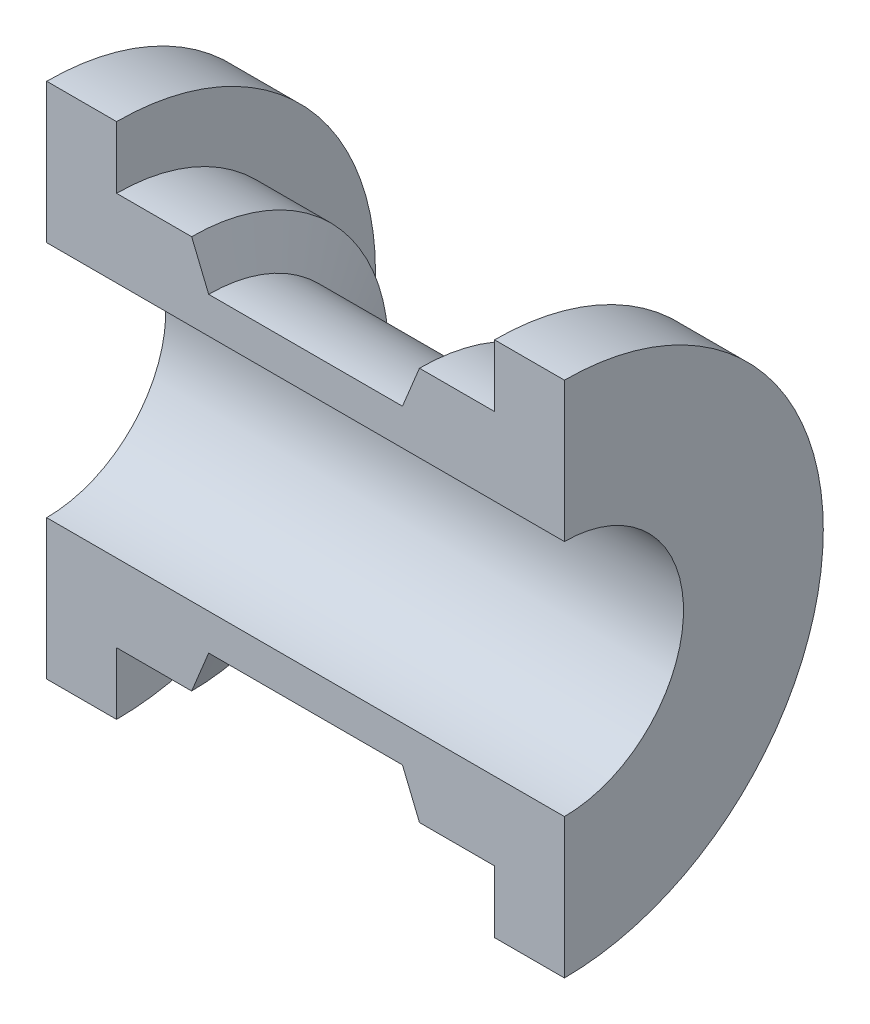
ISO-10303-21;
HEADER;
FILE_DESCRIPTION(('STEP AP214'),'2;1');
FILE_NAME('part.step','',(''),(''),'','','');
FILE_SCHEMA(('AUTOMOTIVE_DESIGN { 1 0 10303 214 1 1 1 1 }'));
ENDSEC;
DATA;
#1=APPLICATION_CONTEXT('core data for automotive mechanical design processes');
#2=APPLICATION_PROTOCOL_DEFINITION('international standard','automotive_design',2000,#1);
#3=PRODUCT_CONTEXT('',#1,'mechanical');
#4=PRODUCT('Part','Part','',(#3));
#5=PRODUCT_RELATED_PRODUCT_CATEGORY('part','',(#4));
#6=PRODUCT_DEFINITION_FORMATION('','',#4);
#7=PRODUCT_DEFINITION_CONTEXT('part definition',#1,'design');
#8=PRODUCT_DEFINITION('design','',#6,#7);
#9=PRODUCT_DEFINITION_SHAPE('','',#8);
#10=(LENGTH_UNIT() NAMED_UNIT(*) SI_UNIT(.MILLI.,.METRE.));
#11=(NAMED_UNIT(*) PLANE_ANGLE_UNIT() SI_UNIT($,.RADIAN.));
#12=(NAMED_UNIT(*) SI_UNIT($,.STERADIAN.) SOLID_ANGLE_UNIT());
#13=UNCERTAINTY_MEASURE_WITH_UNIT(LENGTH_MEASURE(1.E-05),#10,'distance_accuracy_value','');
#14=(GEOMETRIC_REPRESENTATION_CONTEXT(3) GLOBAL_UNCERTAINTY_ASSIGNED_CONTEXT((#13)) GLOBAL_UNIT_ASSIGNED_CONTEXT((#10,
#11,#12)) REPRESENTATION_CONTEXT('',''));
#15=CARTESIAN_POINT('',(0.,0.,0.));
#16=DIRECTION('',(0.,0.,1.));
#17=DIRECTION('',(1.,0.,0.));
#18=AXIS2_PLACEMENT_3D('',#15,#16,#17);
#19=CARTESIAN_POINT('',(-3.,0.,-12.2462854605711));
#20=DIRECTION('',(0.,0.,-1.));
#21=DIRECTION('',(-1.,0.,0.));
#22=AXIS2_PLACEMENT_3D('',#19,#20,#21);
#23=PLANE('',#22);
#24=CARTESIAN_POINT('',(0.,0.,-12.2462854605711));
#25=DIRECTION('',(0.,0.,1.));
#26=DIRECTION('',(1.,0.,0.));
#27=AXIS2_PLACEMENT_3D('',#24,#25,#26);
#28=CIRCLE('',#27,3.);
#29=CARTESIAN_POINT('',(3.,0.,-12.2462854605711));
#30=VERTEX_POINT('',#29);
#31=EDGE_CURVE('E49',#30,#30,#28,.T.);
#32=ORIENTED_EDGE('',*,*,#31,.T.);
#33=EDGE_LOOP('',(#32));
#34=FACE_BOUND('',#33,.T.);
#35=ADVANCED_FACE('F43',(#34),#23,.F.);
#36=CARTESIAN_POINT('',(-3.,0.,-20.));
#37=DIRECTION('',(0.,0.,1.));
#38=DIRECTION('',(1.,0.,0.));
#39=AXIS2_PLACEMENT_3D('',#36,#37,#38);
#40=PLANE('',#39);
#41=CARTESIAN_POINT('',(0.,0.,-20.));
#42=DIRECTION('',(0.,0.,1.));
#43=DIRECTION('',(1.,0.,0.));
#44=AXIS2_PLACEMENT_3D('',#41,#42,#43);
#45=CIRCLE('',#44,3.);
#46=CARTESIAN_POINT('',(3.,0.,-20.));
#47=VERTEX_POINT('',#46);
#48=EDGE_CURVE('E11',#47,#47,#45,.T.);
#49=ORIENTED_EDGE('',*,*,#48,.F.);
#50=EDGE_LOOP('',(#49));
#51=FACE_BOUND('',#50,.T.);
#52=ADVANCED_FACE('F58',(#51),#40,.F.);
#53=CARTESIAN_POINT('',(0.,0.,0.));
#54=DIRECTION('',(0.,0.,1.));
#55=DIRECTION('',(1.,0.,0.));
#56=AXIS2_PLACEMENT_3D('',#53,#54,#55);
#57=CYLINDRICAL_SURFACE('',#56,3.);
#58=ORIENTED_EDGE('',*,*,#31,.F.);
#59=EDGE_LOOP('',(#58));
#60=FACE_BOUND('',#59,.T.);
#61=ORIENTED_EDGE('',*,*,#48,.T.);
#62=EDGE_LOOP('',(#61));
#63=FACE_BOUND('',#62,.T.);
#64=ADVANCED_FACE('F56',(#60,#63),#57,.T.);
#65=CLOSED_SHELL('',(#35,#52,#64));
#66=MANIFOLD_SOLID_BREP('B2',#65);
#67=CARTESIAN_POINT('',(-25.,25.,1.74574066942157E-13));
#68=DIRECTION('',(-1.,0.,0.));
#69=DIRECTION('',(0.,0.,1.));
#70=AXIS2_PLACEMENT_3D('',#67,#68,#69);
#71=PLANE('',#70);
#72=CARTESIAN_POINT('',(-25.,0.,0.));
#73=DIRECTION('',(-1.,0.,0.));
#74=DIRECTION('',(0.,0.,1.));
#75=AXIS2_PLACEMENT_3D('',#72,#73,#74);
#76=CIRCLE('',#75,11.5);
#77=CARTESIAN_POINT('',(-25.,11.5,0.));
#78=VERTEX_POINT('',#77);
#79=CARTESIAN_POINT('',(-25.,-11.5,0.));
#80=VERTEX_POINT('',#79);
#81=EDGE_CURVE('E41',#78,#80,#76,.T.);
#82=ORIENTED_EDGE('',*,*,#81,.F.);
#83=DIRECTION('',(0.,1.,0.));
#84=VECTOR('',#83,1.);
#85=CARTESIAN_POINT('',(-25.,25.,1.74574066942157E-13));
#86=LINE('',#85,#84);
#87=CARTESIAN_POINT('',(-25.,25.,1.74574066942157E-13));
#88=VERTEX_POINT('',#87);
#89=EDGE_CURVE('E173',#78,#88,#86,.T.);
#90=ORIENTED_EDGE('',*,*,#89,.T.);
#91=CARTESIAN_POINT('',(-25.,0.,0.));
#92=DIRECTION('',(-1.,0.,0.));
#93=DIRECTION('',(0.,0.,1.));
#94=AXIS2_PLACEMENT_3D('',#91,#92,#93);
#95=CIRCLE('',#94,25.);
#96=CARTESIAN_POINT('',(-25.,-25.,0.));
#97=VERTEX_POINT('',#96);
#98=EDGE_CURVE('E168',#88,#97,#95,.T.);
#99=ORIENTED_EDGE('',*,*,#98,.T.);
#100=DIRECTION('',(0.,-1.,0.));
#101=VECTOR('',#100,1.);
#102=CARTESIAN_POINT('',(-25.,-25.,0.));
#103=LINE('',#102,#101);
#104=EDGE_CURVE('E171',#80,#97,#103,.T.);
#105=ORIENTED_EDGE('',*,*,#104,.F.);
#106=EDGE_LOOP('',(#82,#90,#99,#105));
#107=FACE_BOUND('',#106,.T.);
#108=ADVANCED_FACE('F84',(#107),#71,.T.);
#109=CARTESIAN_POINT('',(-23.8789507050663,0.,0.));
#110=DIRECTION('',(-1.,0.,0.));
#111=DIRECTION('',(0.,0.,1.));
#112=AXIS2_PLACEMENT_3D('',#109,#110,#111);
#113=CYLINDRICAL_SURFACE('',#112,11.5);
#114=CARTESIAN_POINT('',(25.,0.,0.));
#115=DIRECTION('',(-1.,0.,0.));
#116=DIRECTION('',(0.,0.,1.));
#117=AXIS2_PLACEMENT_3D('',#114,#115,#116);
#118=CIRCLE('',#117,11.5);
#119=CARTESIAN_POINT('',(25.,11.5,0.));
#120=VERTEX_POINT('',#119);
#121=CARTESIAN_POINT('',(25.,-11.5,0.));
#122=VERTEX_POINT('',#121);
#123=EDGE_CURVE('E92',#120,#122,#118,.T.);
#124=ORIENTED_EDGE('',*,*,#123,.F.);
#125=DIRECTION('',(-1.,0.,0.));
#126=VECTOR('',#125,1.);
#127=CARTESIAN_POINT('',(-25.,11.5,0.));
#128=LINE('',#127,#126);
#129=EDGE_CURVE('E178',#120,#78,#128,.T.);
#130=ORIENTED_EDGE('',*,*,#129,.T.);
#131=ORIENTED_EDGE('',*,*,#81,.T.);
#132=DIRECTION('',(-1.,0.,0.));
#133=VECTOR('',#132,1.);
#134=CARTESIAN_POINT('',(-25.,-11.5,0.));
#135=LINE('',#134,#133);
#136=EDGE_CURVE('E191',#122,#80,#135,.T.);
#137=ORIENTED_EDGE('',*,*,#136,.F.);
#138=EDGE_LOOP('',(#124,#130,#131,#137));
#139=FACE_BOUND('',#138,.T.);
#140=ADVANCED_FACE('F86',(#139),#113,.F.);
#141=CARTESIAN_POINT('',(25.,11.5,0.));
#142=DIRECTION('',(1.,0.,0.));
#143=DIRECTION('',(0.,0.,-1.));
#144=AXIS2_PLACEMENT_3D('',#141,#142,#143);
#145=PLANE('',#144);
#146=CARTESIAN_POINT('',(25.,0.,0.));
#147=DIRECTION('',(-1.,0.,0.));
#148=DIRECTION('',(0.,0.,1.));
#149=AXIS2_PLACEMENT_3D('',#146,#147,#148);
#150=CIRCLE('',#149,25.);
#151=CARTESIAN_POINT('',(25.,25.,1.74574066942157E-13));
#152=VERTEX_POINT('',#151);
#153=CARTESIAN_POINT('',(25.,-25.,0.));
#154=VERTEX_POINT('',#153);
#155=EDGE_CURVE('E264',#152,#154,#150,.T.);
#156=ORIENTED_EDGE('',*,*,#155,.F.);
#157=DIRECTION('',(0.,-1.,0.));
#158=VECTOR('',#157,1.);
#159=CARTESIAN_POINT('',(25.,11.5,0.));
#160=LINE('',#159,#158);
#161=EDGE_CURVE('E246',#152,#120,#160,.T.);
#162=ORIENTED_EDGE('',*,*,#161,.T.);
#163=ORIENTED_EDGE('',*,*,#123,.T.);
#164=DIRECTION('',(0.,1.,0.));
#165=VECTOR('',#164,1.);
#166=CARTESIAN_POINT('',(25.,-11.5,0.));
#167=LINE('',#166,#165);
#168=EDGE_CURVE('E216',#154,#122,#167,.T.);
#169=ORIENTED_EDGE('',*,*,#168,.F.);
#170=EDGE_LOOP('',(#156,#162,#163,#169));
#171=FACE_BOUND('',#170,.T.);
#172=ADVANCED_FACE('F267',(#171),#145,.T.);
#173=CARTESIAN_POINT('',(-23.8789507050663,0.,0.));
#174=DIRECTION('',(-1.,0.,0.));
#175=DIRECTION('',(0.,0.,1.));
#176=AXIS2_PLACEMENT_3D('',#173,#174,#175);
#177=CYLINDRICAL_SURFACE('',#176,25.);
#178=CARTESIAN_POINT('',(18.25,0.,0.));
#179=DIRECTION('',(-1.,0.,0.));
#180=DIRECTION('',(0.,0.,1.));
#181=AXIS2_PLACEMENT_3D('',#178,#179,#180);
#182=CIRCLE('',#181,25.);
#183=CARTESIAN_POINT('',(18.25,25.,1.74574066942157E-13));
#184=VERTEX_POINT('',#183);
#185=CARTESIAN_POINT('',(18.25,-25.,0.));
#186=VERTEX_POINT('',#185);
#187=EDGE_CURVE('E262',#184,#186,#182,.T.);
#188=ORIENTED_EDGE('',*,*,#187,.F.);
#189=DIRECTION('',(1.,0.,0.));
#190=VECTOR('',#189,1.);
#191=CARTESIAN_POINT('',(25.,25.,1.74574066942157E-13));
#192=LINE('',#191,#190);
#193=EDGE_CURVE('E243',#184,#152,#192,.T.);
#194=ORIENTED_EDGE('',*,*,#193,.T.);
#195=ORIENTED_EDGE('',*,*,#155,.T.);
#196=DIRECTION('',(1.,0.,0.));
#197=VECTOR('',#196,1.);
#198=CARTESIAN_POINT('',(25.,-25.,0.));
#199=LINE('',#198,#197);
#200=EDGE_CURVE('E213',#186,#154,#199,.T.);
#201=ORIENTED_EDGE('',*,*,#200,.F.);
#202=EDGE_LOOP('',(#188,#194,#195,#201));
#203=FACE_BOUND('',#202,.T.);
#204=ADVANCED_FACE('F302',(#203),#177,.T.);
#205=CARTESIAN_POINT('',(18.25,25.,1.74574066942157E-13));
#206=DIRECTION('',(-1.,0.,0.));
#207=DIRECTION('',(0.,0.,1.));
#208=AXIS2_PLACEMENT_3D('',#205,#206,#207);
#209=PLANE('',#208);
#210=CARTESIAN_POINT('',(18.25,0.,0.));
#211=DIRECTION('',(-1.,0.,0.));
#212=DIRECTION('',(0.,0.,1.));
#213=AXIS2_PLACEMENT_3D('',#210,#211,#212);
#214=CIRCLE('',#213,19.);
#215=CARTESIAN_POINT('',(18.25,19.,1.32676290876039E-13));
#216=VERTEX_POINT('',#215);
#217=CARTESIAN_POINT('',(18.25,-19.,0.));
#218=VERTEX_POINT('',#217);
#219=EDGE_CURVE('E260',#216,#218,#214,.T.);
#220=ORIENTED_EDGE('',*,*,#219,.F.);
#221=DIRECTION('',(0.,1.,0.));
#222=VECTOR('',#221,1.);
#223=CARTESIAN_POINT('',(18.25,25.,1.74574066942157E-13));
#224=LINE('',#223,#222);
#225=EDGE_CURVE('E240',#216,#184,#224,.T.);
#226=ORIENTED_EDGE('',*,*,#225,.T.);
#227=ORIENTED_EDGE('',*,*,#187,.T.);
#228=DIRECTION('',(0.,-1.,0.));
#229=VECTOR('',#228,1.);
#230=CARTESIAN_POINT('',(18.25,-25.,0.));
#231=LINE('',#230,#229);
#232=EDGE_CURVE('E210',#218,#186,#231,.T.);
#233=ORIENTED_EDGE('',*,*,#232,.F.);
#234=EDGE_LOOP('',(#220,#226,#227,#233));
#235=FACE_BOUND('',#234,.T.);
#236=ADVANCED_FACE('F299',(#235),#209,.T.);
#237=CARTESIAN_POINT('',(-23.8789507050663,0.,0.));
#238=DIRECTION('',(-1.,0.,0.));
#239=DIRECTION('',(0.,0.,1.));
#240=AXIS2_PLACEMENT_3D('',#237,#238,#239);
#241=CYLINDRICAL_SURFACE('',#240,19.);
#242=CARTESIAN_POINT('',(11.,0.,0.));
#243=DIRECTION('',(-1.,0.,0.));
#244=DIRECTION('',(0.,0.,1.));
#245=AXIS2_PLACEMENT_3D('',#242,#243,#244);
#246=CIRCLE('',#245,19.);
#247=CARTESIAN_POINT('',(11.,19.,1.32676290876039E-13));
#248=VERTEX_POINT('',#247);
#249=CARTESIAN_POINT('',(11.,-19.,0.));
#250=VERTEX_POINT('',#249);
#251=EDGE_CURVE('E258',#248,#250,#246,.T.);
#252=ORIENTED_EDGE('',*,*,#251,.F.);
#253=DIRECTION('',(1.,0.,0.));
#254=VECTOR('',#253,1.);
#255=CARTESIAN_POINT('',(18.25,19.,1.32676290876039E-13));
#256=LINE('',#255,#254);
#257=EDGE_CURVE('E237',#248,#216,#256,.T.);
#258=ORIENTED_EDGE('',*,*,#257,.T.);
#259=ORIENTED_EDGE('',*,*,#219,.T.);
#260=DIRECTION('',(1.,0.,0.));
#261=VECTOR('',#260,1.);
#262=CARTESIAN_POINT('',(18.25,-19.,0.));
#263=LINE('',#262,#261);
#264=EDGE_CURVE('E207',#250,#218,#263,.T.);
#265=ORIENTED_EDGE('',*,*,#264,.F.);
#266=EDGE_LOOP('',(#252,#258,#259,#265));
#267=FACE_BOUND('',#266,.T.);
#268=ADVANCED_FACE('F296',(#267),#241,.T.);
#269=CARTESIAN_POINT('',(9.35728952772076,0.,0.));
#270=DIRECTION('',(1.,0.,0.));
#271=DIRECTION('',(0.,0.,-1.));
#272=AXIS2_PLACEMENT_3D('',#269,#270,#271);
#273=CONICAL_SURFACE('',#272,15.,1.18111913095403);
#274=CARTESIAN_POINT('',(9.35728952772076,0.,0.));
#275=DIRECTION('',(-1.,0.,0.));
#276=DIRECTION('',(0.,0.,1.));
#277=AXIS2_PLACEMENT_3D('',#274,#275,#276);
#278=CIRCLE('',#277,15.);
#279=CARTESIAN_POINT('',(9.35728952772076,15.,1.04744440165294E-13));
#280=VERTEX_POINT('',#279);
#281=CARTESIAN_POINT('',(9.35728952772076,-15.,0.));
#282=VERTEX_POINT('',#281);
#283=EDGE_CURVE('E256',#280,#282,#278,.T.);
#284=ORIENTED_EDGE('',*,*,#283,.F.);
#285=DIRECTION('',(0.379889830828706,0.925031738067909,0.));
#286=VECTOR('',#285,1.);
#287=CARTESIAN_POINT('',(11.,19.,1.32676290876039E-13));
#288=LINE('',#287,#286);
#289=EDGE_CURVE('E234',#280,#248,#288,.T.);
#290=ORIENTED_EDGE('',*,*,#289,.T.);
#291=ORIENTED_EDGE('',*,*,#251,.T.);
#292=DIRECTION('',(0.379889830828706,-0.925031738067909,0.));
#293=VECTOR('',#292,1.);
#294=CARTESIAN_POINT('',(11.,-19.,0.));
#295=LINE('',#294,#293);
#296=EDGE_CURVE('E204',#282,#250,#295,.T.);
#297=ORIENTED_EDGE('',*,*,#296,.F.);
#298=EDGE_LOOP('',(#284,#290,#291,#297));
#299=FACE_BOUND('',#298,.T.);
#300=ADVANCED_FACE('F291',(#299),#273,.T.);
#301=CARTESIAN_POINT('',(-23.8789507050663,0.,0.));
#302=DIRECTION('',(-1.,0.,0.));
#303=DIRECTION('',(0.,0.,1.));
#304=AXIS2_PLACEMENT_3D('',#301,#302,#303);
#305=CYLINDRICAL_SURFACE('',#304,15.);
#306=CARTESIAN_POINT('',(-9.35728952772074,0.,0.));
#307=DIRECTION('',(-1.,0.,0.));
#308=DIRECTION('',(0.,0.,1.));
#309=AXIS2_PLACEMENT_3D('',#306,#307,#308);
#310=CIRCLE('',#309,15.);
#311=CARTESIAN_POINT('',(-9.35728952772074,15.,1.04744440165294E-13));
#312=VERTEX_POINT('',#311);
#313=CARTESIAN_POINT('',(-9.35728952772074,-15.,0.));
#314=VERTEX_POINT('',#313);
#315=EDGE_CURVE('E254',#312,#314,#310,.T.);
#316=ORIENTED_EDGE('',*,*,#315,.F.);
#317=DIRECTION('',(1.,0.,0.));
#318=VECTOR('',#317,1.);
#319=CARTESIAN_POINT('',(9.35728952772076,15.,1.04744440165294E-13));
#320=LINE('',#319,#318);
#321=EDGE_CURVE('E231',#312,#280,#320,.T.);
#322=ORIENTED_EDGE('',*,*,#321,.T.);
#323=ORIENTED_EDGE('',*,*,#283,.T.);
#324=DIRECTION('',(1.,0.,0.));
#325=VECTOR('',#324,1.);
#326=CARTESIAN_POINT('',(9.35728952772076,-15.,0.));
#327=LINE('',#326,#325);
#328=EDGE_CURVE('E201',#314,#282,#327,.T.);
#329=ORIENTED_EDGE('',*,*,#328,.F.);
#330=EDGE_LOOP('',(#316,#322,#323,#329));
#331=FACE_BOUND('',#330,.T.);
#332=ADVANCED_FACE('F288',(#331),#305,.T.);
#333=CARTESIAN_POINT('',(-11.,0.,0.));
#334=DIRECTION('',(-1.,0.,0.));
#335=DIRECTION('',(0.,0.,1.));
#336=AXIS2_PLACEMENT_3D('',#333,#334,#335);
#337=CONICAL_SURFACE('',#336,19.,1.18111913095403);
#338=CARTESIAN_POINT('',(-11.,0.,0.));
#339=DIRECTION('',(-1.,0.,0.));
#340=DIRECTION('',(0.,0.,1.));
#341=AXIS2_PLACEMENT_3D('',#338,#339,#340);
#342=CIRCLE('',#341,19.);
#343=CARTESIAN_POINT('',(-11.,19.,1.32676290876039E-13));
#344=VERTEX_POINT('',#343);
#345=CARTESIAN_POINT('',(-11.,-19.,0.));
#346=VERTEX_POINT('',#345);
#347=EDGE_CURVE('E252',#344,#346,#342,.T.);
#348=ORIENTED_EDGE('',*,*,#347,.F.);
#349=DIRECTION('',(0.37988983082871,-0.925031738067908,0.));
#350=VECTOR('',#349,1.);
#351=CARTESIAN_POINT('',(-9.35728952772074,15.,1.04744440165294E-13));
#352=LINE('',#351,#350);
#353=EDGE_CURVE('E228',#344,#312,#352,.T.);
#354=ORIENTED_EDGE('',*,*,#353,.T.);
#355=ORIENTED_EDGE('',*,*,#315,.T.);
#356=DIRECTION('',(0.37988983082871,0.925031738067908,0.));
#357=VECTOR('',#356,1.);
#358=CARTESIAN_POINT('',(-9.35728952772074,-15.,0.));
#359=LINE('',#358,#357);
#360=EDGE_CURVE('E198',#346,#314,#359,.T.);
#361=ORIENTED_EDGE('',*,*,#360,.F.);
#362=EDGE_LOOP('',(#348,#354,#355,#361));
#363=FACE_BOUND('',#362,.T.);
#364=ADVANCED_FACE('F283',(#363),#337,.T.);
#365=CARTESIAN_POINT('',(-23.8789507050663,0.,0.));
#366=DIRECTION('',(-1.,0.,0.));
#367=DIRECTION('',(0.,0.,1.));
#368=AXIS2_PLACEMENT_3D('',#365,#366,#367);
#369=CYLINDRICAL_SURFACE('',#368,19.);
#370=CARTESIAN_POINT('',(-18.25,0.,0.));
#371=DIRECTION('',(-1.,0.,0.));
#372=DIRECTION('',(0.,0.,1.));
#373=AXIS2_PLACEMENT_3D('',#370,#371,#372);
#374=CIRCLE('',#373,19.);
#375=CARTESIAN_POINT('',(-18.25,19.,1.32676290876039E-13));
#376=VERTEX_POINT('',#375);
#377=CARTESIAN_POINT('',(-18.25,-19.,0.));
#378=VERTEX_POINT('',#377);
#379=EDGE_CURVE('E250',#376,#378,#374,.T.);
#380=ORIENTED_EDGE('',*,*,#379,.F.);
#381=DIRECTION('',(1.,0.,0.));
#382=VECTOR('',#381,1.);
#383=CARTESIAN_POINT('',(-11.,19.,1.32676290876039E-13));
#384=LINE('',#383,#382);
#385=EDGE_CURVE('E225',#376,#344,#384,.T.);
#386=ORIENTED_EDGE('',*,*,#385,.T.);
#387=ORIENTED_EDGE('',*,*,#347,.T.);
#388=DIRECTION('',(1.,0.,0.));
#389=VECTOR('',#388,1.);
#390=CARTESIAN_POINT('',(-11.,-19.,0.));
#391=LINE('',#390,#389);
#392=EDGE_CURVE('E195',#378,#346,#391,.T.);
#393=ORIENTED_EDGE('',*,*,#392,.F.);
#394=EDGE_LOOP('',(#380,#386,#387,#393));
#395=FACE_BOUND('',#394,.T.);
#396=ADVANCED_FACE('F281',(#395),#369,.T.);
#397=CARTESIAN_POINT('',(-18.25,19.,1.32676290876039E-13));
#398=DIRECTION('',(1.,0.,0.));
#399=DIRECTION('',(0.,0.,-1.));
#400=AXIS2_PLACEMENT_3D('',#397,#398,#399);
#401=PLANE('',#400);
#402=CARTESIAN_POINT('',(-18.25,0.,0.));
#403=DIRECTION('',(-1.,0.,0.));
#404=DIRECTION('',(0.,0.,1.));
#405=AXIS2_PLACEMENT_3D('',#402,#403,#404);
#406=CIRCLE('',#405,25.);
#407=CARTESIAN_POINT('',(-18.25,25.,1.74574066942157E-13));
#408=VERTEX_POINT('',#407);
#409=CARTESIAN_POINT('',(-18.25,-25.,0.));
#410=VERTEX_POINT('',#409);
#411=EDGE_CURVE('E177',#408,#410,#406,.T.);
#412=ORIENTED_EDGE('',*,*,#411,.F.);
#413=DIRECTION('',(0.,-1.,0.));
#414=VECTOR('',#413,1.);
#415=CARTESIAN_POINT('',(-18.25,19.,1.32676290876039E-13));
#416=LINE('',#415,#414);
#417=EDGE_CURVE('E222',#408,#376,#416,.T.);
#418=ORIENTED_EDGE('',*,*,#417,.T.);
#419=ORIENTED_EDGE('',*,*,#379,.T.);
#420=DIRECTION('',(0.,1.,0.));
#421=VECTOR('',#420,1.);
#422=CARTESIAN_POINT('',(-18.25,-19.,0.));
#423=LINE('',#422,#421);
#424=EDGE_CURVE('E186',#410,#378,#423,.T.);
#425=ORIENTED_EDGE('',*,*,#424,.F.);
#426=EDGE_LOOP('',(#412,#418,#419,#425));
#427=FACE_BOUND('',#426,.T.);
#428=ADVANCED_FACE('F277',(#427),#401,.T.);
#429=CARTESIAN_POINT('',(-23.8789507050663,0.,0.));
#430=DIRECTION('',(-1.,0.,0.));
#431=DIRECTION('',(0.,0.,1.));
#432=AXIS2_PLACEMENT_3D('',#429,#430,#431);
#433=CYLINDRICAL_SURFACE('',#432,25.);
#434=DIRECTION('',(1.,0.,0.));
#435=VECTOR('',#434,1.);
#436=CARTESIAN_POINT('',(-18.25,25.,1.74574066942157E-13));
#437=LINE('',#436,#435);
#438=EDGE_CURVE('E220',#88,#408,#437,.T.);
#439=ORIENTED_EDGE('',*,*,#438,.T.);
#440=ORIENTED_EDGE('',*,*,#411,.T.);
#441=DIRECTION('',(1.,0.,0.));
#442=VECTOR('',#441,1.);
#443=CARTESIAN_POINT('',(-18.25,-25.,0.));
#444=LINE('',#443,#442);
#445=EDGE_CURVE('E181',#97,#410,#444,.T.);
#446=ORIENTED_EDGE('',*,*,#445,.F.);
#447=ORIENTED_EDGE('',*,*,#98,.F.);
#448=EDGE_LOOP('',(#439,#440,#446,#447));
#449=FACE_BOUND('',#448,.T.);
#450=ADVANCED_FACE('F182',(#449),#433,.T.);
#451=CARTESIAN_POINT('',(0.,0.,0.));
#452=DIRECTION('',(0.,0.,1.));
#453=DIRECTION('',(-1.,0.,0.));
#454=AXIS2_PLACEMENT_3D('',#451,#452,#453);
#455=PLANE('',#454);
#456=ORIENTED_EDGE('',*,*,#89,.F.);
#457=ORIENTED_EDGE('',*,*,#129,.F.);
#458=ORIENTED_EDGE('',*,*,#161,.F.);
#459=ORIENTED_EDGE('',*,*,#193,.F.);
#460=ORIENTED_EDGE('',*,*,#225,.F.);
#461=ORIENTED_EDGE('',*,*,#257,.F.);
#462=ORIENTED_EDGE('',*,*,#289,.F.);
#463=ORIENTED_EDGE('',*,*,#321,.F.);
#464=ORIENTED_EDGE('',*,*,#353,.F.);
#465=ORIENTED_EDGE('',*,*,#385,.F.);
#466=ORIENTED_EDGE('',*,*,#417,.F.);
#467=ORIENTED_EDGE('',*,*,#438,.F.);
#468=EDGE_LOOP('',(#456,#457,#458,#459,#460,#461,#462,#463,#464,#465,#466,#467));
#469=FACE_BOUND('',#468,.T.);
#470=ADVANCED_FACE('F272',(#469),#455,.T.);
#471=CARTESIAN_POINT('',(0.,0.,0.));
#472=DIRECTION('',(0.,0.,-1.));
#473=DIRECTION('',(-1.,0.,0.));
#474=AXIS2_PLACEMENT_3D('',#471,#472,#473);
#475=PLANE('',#474);
#476=ORIENTED_EDGE('',*,*,#104,.T.);
#477=ORIENTED_EDGE('',*,*,#445,.T.);
#478=ORIENTED_EDGE('',*,*,#424,.T.);
#479=ORIENTED_EDGE('',*,*,#392,.T.);
#480=ORIENTED_EDGE('',*,*,#360,.T.);
#481=ORIENTED_EDGE('',*,*,#328,.T.);
#482=ORIENTED_EDGE('',*,*,#296,.T.);
#483=ORIENTED_EDGE('',*,*,#264,.T.);
#484=ORIENTED_EDGE('',*,*,#232,.T.);
#485=ORIENTED_EDGE('',*,*,#200,.T.);
#486=ORIENTED_EDGE('',*,*,#168,.T.);
#487=ORIENTED_EDGE('',*,*,#136,.T.);
#488=EDGE_LOOP('',(#476,#477,#478,#479,#480,#481,#482,#483,#484,#485,#486,#487));
#489=FACE_BOUND('',#488,.T.);
#490=ADVANCED_FACE('F189',(#489),#475,.F.);
#491=CLOSED_SHELL('',(#108,#140,#172,#204,#236,#268,#300,#332,#364,#396,#428,#450,#470,#490));
#492=MANIFOLD_SOLID_BREP('B6',#491);
#493=ADVANCED_BREP_SHAPE_REPRESENTATION('',(#18,#66,#492),#14);
#494=SHAPE_DEFINITION_REPRESENTATION(#9,#493);
ENDSEC;
END-ISO-10303-21;
